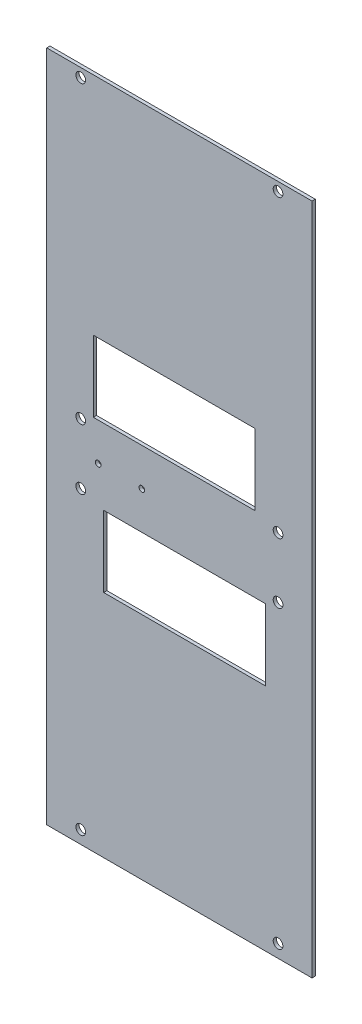
ISO-10303-21;
HEADER;
FILE_DESCRIPTION(('STEP AP214'),'2;1');
FILE_NAME('part.step','',(''),(''),'','','');
FILE_SCHEMA(('AUTOMOTIVE_DESIGN { 1 0 10303 214 1 1 1 1 }'));
ENDSEC;
DATA;
#1=APPLICATION_CONTEXT('core data for automotive mechanical design processes');
#2=APPLICATION_PROTOCOL_DEFINITION('international standard','automotive_design',2000,#1);
#3=PRODUCT_CONTEXT('',#1,'mechanical');
#4=PRODUCT('Part','Part','',(#3));
#5=PRODUCT_RELATED_PRODUCT_CATEGORY('part','',(#4));
#6=PRODUCT_DEFINITION_FORMATION('','',#4);
#7=PRODUCT_DEFINITION_CONTEXT('part definition',#1,'design');
#8=PRODUCT_DEFINITION('design','',#6,#7);
#9=PRODUCT_DEFINITION_SHAPE('','',#8);
#10=(LENGTH_UNIT() NAMED_UNIT(*) SI_UNIT(.MILLI.,.METRE.));
#11=(NAMED_UNIT(*) PLANE_ANGLE_UNIT() SI_UNIT($,.RADIAN.));
#12=(NAMED_UNIT(*) SI_UNIT($,.STERADIAN.) SOLID_ANGLE_UNIT());
#13=UNCERTAINTY_MEASURE_WITH_UNIT(LENGTH_MEASURE(1.E-05),#10,'distance_accuracy_value','');
#14=(GEOMETRIC_REPRESENTATION_CONTEXT(3) GLOBAL_UNCERTAINTY_ASSIGNED_CONTEXT((#13)) GLOBAL_UNIT_ASSIGNED_CONTEXT((#10,
#11,#12)) REPRESENTATION_CONTEXT('',''));
#15=CARTESIAN_POINT('',(0.,0.,0.));
#16=DIRECTION('',(0.,0.,1.));
#17=DIRECTION('',(1.,0.,0.));
#18=AXIS2_PLACEMENT_3D('',#15,#16,#17);
#19=CARTESIAN_POINT('',(41.6,-104.,1.));
#20=DIRECTION('',(0.,1.,0.));
#21=DIRECTION('',(-1.,0.,0.));
#22=AXIS2_PLACEMENT_3D('',#19,#20,#21);
#23=PLANE('',#22);
#24=DIRECTION('',(0.,0.,1.));
#25=VECTOR('',#24,1.);
#26=CARTESIAN_POINT('',(-41.,-104.,-9.));
#27=LINE('',#26,#25);
#28=CARTESIAN_POINT('',(-41.,-104.,0.));
#29=VERTEX_POINT('',#28);
#30=CARTESIAN_POINT('',(-41.,-104.,1.));
#31=VERTEX_POINT('',#30);
#32=EDGE_CURVE('E128',#29,#31,#27,.T.);
#33=ORIENTED_EDGE('',*,*,#32,.F.);
#34=DIRECTION('',(1.,0.,0.));
#35=VECTOR('',#34,1.);
#36=CARTESIAN_POINT('',(41.6,-104.,0.));
#37=LINE('',#36,#35);
#38=CARTESIAN_POINT('',(41.,-104.,0.));
#39=VERTEX_POINT('',#38);
#40=EDGE_CURVE('E137',#29,#39,#37,.T.);
#41=ORIENTED_EDGE('',*,*,#40,.T.);
#42=DIRECTION('',(0.,0.,1.));
#43=VECTOR('',#42,1.);
#44=CARTESIAN_POINT('',(41.,-104.,-9.));
#45=LINE('',#44,#43);
#46=CARTESIAN_POINT('',(41.,-104.,1.));
#47=VERTEX_POINT('',#46);
#48=EDGE_CURVE('E49',#39,#47,#45,.T.);
#49=ORIENTED_EDGE('',*,*,#48,.T.);
#50=DIRECTION('',(1.,0.,0.));
#51=VECTOR('',#50,1.);
#52=CARTESIAN_POINT('',(41.6,-104.,1.));
#53=LINE('',#52,#51);
#54=EDGE_CURVE('E135',#31,#47,#53,.T.);
#55=ORIENTED_EDGE('',*,*,#54,.F.);
#56=EDGE_LOOP('',(#33,#41,#49,#55));
#57=FACE_BOUND('',#56,.T.);
#58=ADVANCED_FACE('F35',(#57),#23,.F.);
#59=CARTESIAN_POINT('',(41.6,104.,1.));
#60=DIRECTION('',(0.,-1.,0.));
#61=DIRECTION('',(0.,0.,-1.));
#62=AXIS2_PLACEMENT_3D('',#59,#60,#61);
#63=PLANE('',#62);
#64=DIRECTION('',(0.,0.,1.));
#65=VECTOR('',#64,1.);
#66=CARTESIAN_POINT('',(-41.,104.,-9.));
#67=LINE('',#66,#65);
#68=CARTESIAN_POINT('',(-41.,104.,0.));
#69=VERTEX_POINT('',#68);
#70=CARTESIAN_POINT('',(-41.,104.,1.));
#71=VERTEX_POINT('',#70);
#72=EDGE_CURVE('E56',#69,#71,#67,.T.);
#73=ORIENTED_EDGE('',*,*,#72,.T.);
#74=DIRECTION('',(-1.,0.,0.));
#75=VECTOR('',#74,1.);
#76=CARTESIAN_POINT('',(41.6,104.,1.));
#77=LINE('',#76,#75);
#78=CARTESIAN_POINT('',(41.,104.,1.));
#79=VERTEX_POINT('',#78);
#80=EDGE_CURVE('E141',#79,#71,#77,.T.);
#81=ORIENTED_EDGE('',*,*,#80,.F.);
#82=DIRECTION('',(0.,0.,1.));
#83=VECTOR('',#82,1.);
#84=CARTESIAN_POINT('',(41.,104.,-9.));
#85=LINE('',#84,#83);
#86=CARTESIAN_POINT('',(41.,104.,0.));
#87=VERTEX_POINT('',#86);
#88=EDGE_CURVE('E123',#87,#79,#85,.T.);
#89=ORIENTED_EDGE('',*,*,#88,.F.);
#90=DIRECTION('',(-1.,0.,0.));
#91=VECTOR('',#90,1.);
#92=CARTESIAN_POINT('',(41.6,104.,0.));
#93=LINE('',#92,#91);
#94=EDGE_CURVE('E142',#87,#69,#93,.T.);
#95=ORIENTED_EDGE('',*,*,#94,.T.);
#96=EDGE_LOOP('',(#73,#81,#89,#95));
#97=FACE_BOUND('',#96,.T.);
#98=ADVANCED_FACE('F178',(#97),#63,.F.);
#99=CARTESIAN_POINT('',(0.,0.,1.));
#100=DIRECTION('',(0.,0.,1.));
#101=DIRECTION('',(1.,0.,0.));
#102=AXIS2_PLACEMENT_3D('',#99,#100,#101);
#103=PLANE('',#102);
#104=CARTESIAN_POINT('',(-25.0999759143177,0.649999999999928,1.));
#105=DIRECTION('',(0.,0.,1.));
#106=DIRECTION('',(1.,0.,0.));
#107=AXIS2_PLACEMENT_3D('',#104,#105,#106);
#108=CIRCLE('',#107,0.874999999999987);
#109=CARTESIAN_POINT('',(-24.2249759143177,0.649999999999928,1.));
#110=VERTEX_POINT('',#109);
#111=EDGE_CURVE('E184',#110,#110,#108,.T.);
#112=ORIENTED_EDGE('',*,*,#111,.F.);
#113=EDGE_LOOP('',(#112));
#114=FACE_BOUND('',#113,.T.);
#115=CARTESIAN_POINT('',(-11.5999759143177,0.649999999999929,1.));
#116=DIRECTION('',(0.,0.,1.));
#117=DIRECTION('',(1.,0.,0.));
#118=AXIS2_PLACEMENT_3D('',#115,#116,#117);
#119=CIRCLE('',#118,0.874999999999987);
#120=CARTESIAN_POINT('',(-10.7249759143177,0.649999999999929,1.));
#121=VERTEX_POINT('',#120);
#122=EDGE_CURVE('E190',#121,#121,#119,.T.);
#123=ORIENTED_EDGE('',*,*,#122,.F.);
#124=EDGE_LOOP('',(#123));
#125=FACE_BOUND('',#124,.T.);
#126=DIRECTION('',(0.,1.,0.));
#127=VECTOR('',#126,1.);
#128=CARTESIAN_POINT('',(23.4,34.3,1.));
#129=LINE('',#128,#127);
#130=CARTESIAN_POINT('',(23.4,12.3,1.));
#131=VERTEX_POINT('',#130);
#132=CARTESIAN_POINT('',(23.4,34.3,1.));
#133=VERTEX_POINT('',#132);
#134=EDGE_CURVE('E196',#131,#133,#129,.T.);
#135=ORIENTED_EDGE('',*,*,#134,.F.);
#136=DIRECTION('',(1.,0.,0.));
#137=VECTOR('',#136,1.);
#138=CARTESIAN_POINT('',(23.4,12.3,1.));
#139=LINE('',#138,#137);
#140=CARTESIAN_POINT('',(-26.6,12.3,1.));
#141=VERTEX_POINT('',#140);
#142=EDGE_CURVE('E204',#141,#131,#139,.T.);
#143=ORIENTED_EDGE('',*,*,#142,.F.);
#144=DIRECTION('',(0.,-1.,0.));
#145=VECTOR('',#144,1.);
#146=CARTESIAN_POINT('',(-26.6,34.3,1.));
#147=LINE('',#146,#145);
#148=CARTESIAN_POINT('',(-26.6,34.3,1.));
#149=VERTEX_POINT('',#148);
#150=EDGE_CURVE('E201',#149,#141,#147,.T.);
#151=ORIENTED_EDGE('',*,*,#150,.F.);
#152=DIRECTION('',(-1.,0.,0.));
#153=VECTOR('',#152,1.);
#154=CARTESIAN_POINT('',(23.4,34.3,1.));
#155=LINE('',#154,#153);
#156=EDGE_CURVE('E198',#133,#149,#155,.T.);
#157=ORIENTED_EDGE('',*,*,#156,.F.);
#158=EDGE_LOOP('',(#135,#143,#151,#157));
#159=FACE_BOUND('',#158,.T.);
#160=DIRECTION('',(0.,-1.,0.));
#161=VECTOR('',#160,1.);
#162=CARTESIAN_POINT('',(-23.4,-33.,1.));
#163=LINE('',#162,#161);
#164=CARTESIAN_POINT('',(-23.4,-11.,1.));
#165=VERTEX_POINT('',#164);
#166=CARTESIAN_POINT('',(-23.4,-33.,1.));
#167=VERTEX_POINT('',#166);
#168=EDGE_CURVE('E210',#165,#167,#163,.T.);
#169=ORIENTED_EDGE('',*,*,#168,.F.);
#170=DIRECTION('',(-1.,0.,0.));
#171=VECTOR('',#170,1.);
#172=CARTESIAN_POINT('',(-23.4,-11.,1.));
#173=LINE('',#172,#171);
#174=CARTESIAN_POINT('',(26.6,-11.,1.));
#175=VERTEX_POINT('',#174);
#176=EDGE_CURVE('E224',#175,#165,#173,.T.);
#177=ORIENTED_EDGE('',*,*,#176,.F.);
#178=DIRECTION('',(0.,1.,0.));
#179=VECTOR('',#178,1.);
#180=CARTESIAN_POINT('',(26.6,-33.,1.));
#181=LINE('',#180,#179);
#182=CARTESIAN_POINT('',(26.6,-33.,1.));
#183=VERTEX_POINT('',#182);
#184=EDGE_CURVE('E221',#183,#175,#181,.T.);
#185=ORIENTED_EDGE('',*,*,#184,.F.);
#186=DIRECTION('',(1.,0.,0.));
#187=VECTOR('',#186,1.);
#188=CARTESIAN_POINT('',(-23.4,-33.,1.));
#189=LINE('',#188,#187);
#190=EDGE_CURVE('E218',#167,#183,#189,.T.);
#191=ORIENTED_EDGE('',*,*,#190,.F.);
#192=EDGE_LOOP('',(#169,#177,#185,#191));
#193=FACE_BOUND('',#192,.T.);
#194=CARTESIAN_POINT('',(-30.5,9.99999999999963,1.));
#195=DIRECTION('',(0.,0.,1.));
#196=DIRECTION('',(1.,0.,0.));
#197=AXIS2_PLACEMENT_3D('',#194,#195,#196);
#198=CIRCLE('',#197,1.5);
#199=CARTESIAN_POINT('',(-29.,9.99999999999963,1.));
#200=VERTEX_POINT('',#199);
#201=EDGE_CURVE('E230',#200,#200,#198,.T.);
#202=ORIENTED_EDGE('',*,*,#201,.F.);
#203=EDGE_LOOP('',(#202));
#204=FACE_BOUND('',#203,.T.);
#205=CARTESIAN_POINT('',(30.5,9.9999999999994,1.));
#206=DIRECTION('',(0.,0.,1.));
#207=DIRECTION('',(1.,0.,0.));
#208=AXIS2_PLACEMENT_3D('',#205,#206,#207);
#209=CIRCLE('',#208,1.5);
#210=CARTESIAN_POINT('',(32.,9.9999999999994,1.));
#211=VERTEX_POINT('',#210);
#212=EDGE_CURVE('E242',#211,#211,#209,.T.);
#213=ORIENTED_EDGE('',*,*,#212,.F.);
#214=EDGE_LOOP('',(#213));
#215=FACE_BOUND('',#214,.T.);
#216=CARTESIAN_POINT('',(30.5,-100.,1.));
#217=DIRECTION('',(0.,0.,1.));
#218=DIRECTION('',(1.,0.,0.));
#219=AXIS2_PLACEMENT_3D('',#216,#217,#218);
#220=CIRCLE('',#219,1.5);
#221=CARTESIAN_POINT('',(32.,-100.,1.));
#222=VERTEX_POINT('',#221);
#223=EDGE_CURVE('E248',#222,#222,#220,.T.);
#224=ORIENTED_EDGE('',*,*,#223,.F.);
#225=EDGE_LOOP('',(#224));
#226=FACE_BOUND('',#225,.T.);
#227=CARTESIAN_POINT('',(-30.5,-100.,1.));
#228=DIRECTION('',(0.,0.,1.));
#229=DIRECTION('',(1.,0.,0.));
#230=AXIS2_PLACEMENT_3D('',#227,#228,#229);
#231=CIRCLE('',#230,1.5);
#232=CARTESIAN_POINT('',(-29.,-100.,1.));
#233=VERTEX_POINT('',#232);
#234=EDGE_CURVE('E254',#233,#233,#231,.T.);
#235=ORIENTED_EDGE('',*,*,#234,.F.);
#236=EDGE_LOOP('',(#235));
#237=FACE_BOUND('',#236,.T.);
#238=CARTESIAN_POINT('',(-30.5,101.3,1.));
#239=DIRECTION('',(0.,0.,1.));
#240=DIRECTION('',(1.,0.,0.));
#241=AXIS2_PLACEMENT_3D('',#238,#239,#240);
#242=CIRCLE('',#241,1.5);
#243=CARTESIAN_POINT('',(-29.,101.3,1.));
#244=VERTEX_POINT('',#243);
#245=EDGE_CURVE('E260',#244,#244,#242,.T.);
#246=ORIENTED_EDGE('',*,*,#245,.F.);
#247=EDGE_LOOP('',(#246));
#248=FACE_BOUND('',#247,.T.);
#249=CARTESIAN_POINT('',(30.5,101.3,1.));
#250=DIRECTION('',(0.,0.,1.));
#251=DIRECTION('',(1.,0.,0.));
#252=AXIS2_PLACEMENT_3D('',#249,#250,#251);
#253=CIRCLE('',#252,1.5);
#254=CARTESIAN_POINT('',(32.,101.3,1.));
#255=VERTEX_POINT('',#254);
#256=EDGE_CURVE('E266',#255,#255,#253,.T.);
#257=ORIENTED_EDGE('',*,*,#256,.F.);
#258=EDGE_LOOP('',(#257));
#259=FACE_BOUND('',#258,.T.);
#260=CARTESIAN_POINT('',(-30.5000000000001,-8.70000000000008,1.));
#261=DIRECTION('',(0.,0.,1.));
#262=DIRECTION('',(1.,0.,0.));
#263=AXIS2_PLACEMENT_3D('',#260,#261,#262);
#264=CIRCLE('',#263,1.5);
#265=CARTESIAN_POINT('',(-29.0000000000001,-8.70000000000008,1.));
#266=VERTEX_POINT('',#265);
#267=EDGE_CURVE('E272',#266,#266,#264,.T.);
#268=ORIENTED_EDGE('',*,*,#267,.F.);
#269=EDGE_LOOP('',(#268));
#270=FACE_BOUND('',#269,.T.);
#271=CARTESIAN_POINT('',(30.4999999999999,-8.70000000000004,1.));
#272=DIRECTION('',(0.,0.,1.));
#273=DIRECTION('',(1.,0.,0.));
#274=AXIS2_PLACEMENT_3D('',#271,#272,#273);
#275=CIRCLE('',#274,1.5);
#276=CARTESIAN_POINT('',(31.9999999999999,-8.70000000000004,1.));
#277=VERTEX_POINT('',#276);
#278=EDGE_CURVE('E277',#277,#277,#275,.T.);
#279=ORIENTED_EDGE('',*,*,#278,.F.);
#280=EDGE_LOOP('',(#279));
#281=FACE_BOUND('',#280,.T.);
#282=ORIENTED_EDGE('',*,*,#80,.T.);
#283=DIRECTION('',(0.,-1.,0.));
#284=VECTOR('',#283,1.);
#285=CARTESIAN_POINT('',(-41.,-104.,1.));
#286=LINE('',#285,#284);
#287=EDGE_CURVE('E129',#71,#31,#286,.T.);
#288=ORIENTED_EDGE('',*,*,#287,.T.);
#289=ORIENTED_EDGE('',*,*,#54,.T.);
#290=DIRECTION('',(0.,1.,0.));
#291=VECTOR('',#290,1.);
#292=CARTESIAN_POINT('',(41.,-104.,1.));
#293=LINE('',#292,#291);
#294=EDGE_CURVE('E120',#47,#79,#293,.T.);
#295=ORIENTED_EDGE('',*,*,#294,.T.);
#296=EDGE_LOOP('',(#282,#288,#289,#295));
#297=FACE_BOUND('',#296,.T.);
#298=ADVANCED_FACE('F140',(#114,#125,#159,#193,#204,#215,#226,#237,#248,#259,#270,#281,#297),
#103,.T.);
#299=CARTESIAN_POINT('',(0.,0.,0.));
#300=DIRECTION('',(0.,0.,1.));
#301=DIRECTION('',(1.,0.,0.));
#302=AXIS2_PLACEMENT_3D('',#299,#300,#301);
#303=PLANE('',#302);
#304=CARTESIAN_POINT('',(-25.0999759143177,0.649999999999928,0.));
#305=DIRECTION('',(0.,0.,1.));
#306=DIRECTION('',(1.,0.,0.));
#307=AXIS2_PLACEMENT_3D('',#304,#305,#306);
#308=CIRCLE('',#307,0.874999999999997);
#309=CARTESIAN_POINT('',(-24.2249759143177,0.649999999999928,0.));
#310=VERTEX_POINT('',#309);
#311=EDGE_CURVE('E187',#310,#310,#308,.T.);
#312=ORIENTED_EDGE('',*,*,#311,.T.);
#313=EDGE_LOOP('',(#312));
#314=FACE_BOUND('',#313,.T.);
#315=CARTESIAN_POINT('',(-11.5999759143177,0.649999999999929,0.));
#316=DIRECTION('',(0.,0.,1.));
#317=DIRECTION('',(1.,0.,0.));
#318=AXIS2_PLACEMENT_3D('',#315,#316,#317);
#319=CIRCLE('',#318,0.874999999999999);
#320=CARTESIAN_POINT('',(-10.7249759143177,0.649999999999929,0.));
#321=VERTEX_POINT('',#320);
#322=EDGE_CURVE('E193',#321,#321,#319,.T.);
#323=ORIENTED_EDGE('',*,*,#322,.T.);
#324=EDGE_LOOP('',(#323));
#325=FACE_BOUND('',#324,.T.);
#326=DIRECTION('',(1.,0.,0.));
#327=VECTOR('',#326,1.);
#328=CARTESIAN_POINT('',(0.,12.3,0.));
#329=LINE('',#328,#327);
#330=CARTESIAN_POINT('',(-26.6,12.3,0.));
#331=VERTEX_POINT('',#330);
#332=CARTESIAN_POINT('',(23.4,12.3,0.));
#333=VERTEX_POINT('',#332);
#334=EDGE_CURVE('E170',#331,#333,#329,.T.);
#335=ORIENTED_EDGE('',*,*,#334,.T.);
#336=DIRECTION('',(0.,1.,0.));
#337=VECTOR('',#336,1.);
#338=CARTESIAN_POINT('',(23.4,0.,0.));
#339=LINE('',#338,#337);
#340=CARTESIAN_POINT('',(23.4,34.3,0.));
#341=VERTEX_POINT('',#340);
#342=EDGE_CURVE('E173',#333,#341,#339,.T.);
#343=ORIENTED_EDGE('',*,*,#342,.T.);
#344=DIRECTION('',(-1.,0.,0.));
#345=VECTOR('',#344,1.);
#346=CARTESIAN_POINT('',(0.,34.3,0.));
#347=LINE('',#346,#345);
#348=CARTESIAN_POINT('',(-26.6,34.3,0.));
#349=VERTEX_POINT('',#348);
#350=EDGE_CURVE('E164',#341,#349,#347,.T.);
#351=ORIENTED_EDGE('',*,*,#350,.T.);
#352=DIRECTION('',(0.,-1.,0.));
#353=VECTOR('',#352,1.);
#354=CARTESIAN_POINT('',(-26.6,0.,0.));
#355=LINE('',#354,#353);
#356=EDGE_CURVE('E167',#349,#331,#355,.T.);
#357=ORIENTED_EDGE('',*,*,#356,.T.);
#358=EDGE_LOOP('',(#335,#343,#351,#357));
#359=FACE_BOUND('',#358,.T.);
#360=DIRECTION('',(-1.,0.,0.));
#361=VECTOR('',#360,1.);
#362=CARTESIAN_POINT('',(0.,-11.,0.));
#363=LINE('',#362,#361);
#364=CARTESIAN_POINT('',(26.6,-11.,0.));
#365=VERTEX_POINT('',#364);
#366=CARTESIAN_POINT('',(-23.4,-11.,0.));
#367=VERTEX_POINT('',#366);
#368=EDGE_CURVE('E158',#365,#367,#363,.T.);
#369=ORIENTED_EDGE('',*,*,#368,.T.);
#370=DIRECTION('',(0.,-1.,0.));
#371=VECTOR('',#370,1.);
#372=CARTESIAN_POINT('',(-23.4,0.,0.));
#373=LINE('',#372,#371);
#374=CARTESIAN_POINT('',(-23.4,-33.,0.));
#375=VERTEX_POINT('',#374);
#376=EDGE_CURVE('E161',#367,#375,#373,.T.);
#377=ORIENTED_EDGE('',*,*,#376,.T.);
#378=DIRECTION('',(1.,0.,0.));
#379=VECTOR('',#378,1.);
#380=CARTESIAN_POINT('',(0.,-33.,0.));
#381=LINE('',#380,#379);
#382=CARTESIAN_POINT('',(26.6,-33.,0.));
#383=VERTEX_POINT('',#382);
#384=EDGE_CURVE('E144',#375,#383,#381,.T.);
#385=ORIENTED_EDGE('',*,*,#384,.T.);
#386=DIRECTION('',(0.,1.,0.));
#387=VECTOR('',#386,1.);
#388=CARTESIAN_POINT('',(26.6,0.,0.));
#389=LINE('',#388,#387);
#390=EDGE_CURVE('E155',#383,#365,#389,.T.);
#391=ORIENTED_EDGE('',*,*,#390,.T.);
#392=EDGE_LOOP('',(#369,#377,#385,#391));
#393=FACE_BOUND('',#392,.T.);
#394=CARTESIAN_POINT('',(-30.5,9.99999999999963,0.));
#395=DIRECTION('',(0.,0.,1.));
#396=DIRECTION('',(1.,0.,0.));
#397=AXIS2_PLACEMENT_3D('',#394,#395,#396);
#398=CIRCLE('',#397,1.5);
#399=CARTESIAN_POINT('',(-29.,9.99999999999963,0.));
#400=VERTEX_POINT('',#399);
#401=EDGE_CURVE('E239',#400,#400,#398,.T.);
#402=ORIENTED_EDGE('',*,*,#401,.T.);
#403=EDGE_LOOP('',(#402));
#404=FACE_BOUND('',#403,.T.);
#405=CARTESIAN_POINT('',(30.5,9.9999999999994,0.));
#406=DIRECTION('',(0.,0.,1.));
#407=DIRECTION('',(1.,0.,0.));
#408=AXIS2_PLACEMENT_3D('',#405,#406,#407);
#409=CIRCLE('',#408,1.5);
#410=CARTESIAN_POINT('',(32.,9.9999999999994,0.));
#411=VERTEX_POINT('',#410);
#412=EDGE_CURVE('E245',#411,#411,#409,.T.);
#413=ORIENTED_EDGE('',*,*,#412,.T.);
#414=EDGE_LOOP('',(#413));
#415=FACE_BOUND('',#414,.T.);
#416=CARTESIAN_POINT('',(30.5,-100.,0.));
#417=DIRECTION('',(0.,0.,1.));
#418=DIRECTION('',(1.,0.,0.));
#419=AXIS2_PLACEMENT_3D('',#416,#417,#418);
#420=CIRCLE('',#419,1.5);
#421=CARTESIAN_POINT('',(32.,-100.,0.));
#422=VERTEX_POINT('',#421);
#423=EDGE_CURVE('E251',#422,#422,#420,.T.);
#424=ORIENTED_EDGE('',*,*,#423,.T.);
#425=EDGE_LOOP('',(#424));
#426=FACE_BOUND('',#425,.T.);
#427=CARTESIAN_POINT('',(-30.5,-100.,0.));
#428=DIRECTION('',(0.,0.,1.));
#429=DIRECTION('',(1.,0.,0.));
#430=AXIS2_PLACEMENT_3D('',#427,#428,#429);
#431=CIRCLE('',#430,1.5);
#432=CARTESIAN_POINT('',(-29.,-100.,0.));
#433=VERTEX_POINT('',#432);
#434=EDGE_CURVE('E257',#433,#433,#431,.T.);
#435=ORIENTED_EDGE('',*,*,#434,.T.);
#436=EDGE_LOOP('',(#435));
#437=FACE_BOUND('',#436,.T.);
#438=CARTESIAN_POINT('',(-30.5,101.3,0.));
#439=DIRECTION('',(0.,0.,1.));
#440=DIRECTION('',(1.,0.,0.));
#441=AXIS2_PLACEMENT_3D('',#438,#439,#440);
#442=CIRCLE('',#441,1.5);
#443=CARTESIAN_POINT('',(-29.,101.3,0.));
#444=VERTEX_POINT('',#443);
#445=EDGE_CURVE('E263',#444,#444,#442,.T.);
#446=ORIENTED_EDGE('',*,*,#445,.T.);
#447=EDGE_LOOP('',(#446));
#448=FACE_BOUND('',#447,.T.);
#449=CARTESIAN_POINT('',(30.5,101.3,0.));
#450=DIRECTION('',(0.,0.,1.));
#451=DIRECTION('',(1.,0.,0.));
#452=AXIS2_PLACEMENT_3D('',#449,#450,#451);
#453=CIRCLE('',#452,1.5);
#454=CARTESIAN_POINT('',(32.,101.3,0.));
#455=VERTEX_POINT('',#454);
#456=EDGE_CURVE('E269',#455,#455,#453,.T.);
#457=ORIENTED_EDGE('',*,*,#456,.T.);
#458=EDGE_LOOP('',(#457));
#459=FACE_BOUND('',#458,.T.);
#460=CARTESIAN_POINT('',(-30.5000000000001,-8.70000000000008,0.));
#461=DIRECTION('',(0.,0.,1.));
#462=DIRECTION('',(1.,0.,0.));
#463=AXIS2_PLACEMENT_3D('',#460,#461,#462);
#464=CIRCLE('',#463,1.5);
#465=CARTESIAN_POINT('',(-29.0000000000001,-8.70000000000008,0.));
#466=VERTEX_POINT('',#465);
#467=EDGE_CURVE('E275',#466,#466,#464,.T.);
#468=ORIENTED_EDGE('',*,*,#467,.T.);
#469=EDGE_LOOP('',(#468));
#470=FACE_BOUND('',#469,.T.);
#471=CARTESIAN_POINT('',(30.4999999999999,-8.70000000000004,0.));
#472=DIRECTION('',(0.,0.,1.));
#473=DIRECTION('',(1.,0.,0.));
#474=AXIS2_PLACEMENT_3D('',#471,#472,#473);
#475=CIRCLE('',#474,1.5);
#476=CARTESIAN_POINT('',(31.9999999999999,-8.70000000000004,0.));
#477=VERTEX_POINT('',#476);
#478=EDGE_CURVE('E149',#477,#477,#475,.T.);
#479=ORIENTED_EDGE('',*,*,#478,.T.);
#480=EDGE_LOOP('',(#479));
#481=FACE_BOUND('',#480,.T.);
#482=DIRECTION('',(0.,-1.,0.));
#483=VECTOR('',#482,1.);
#484=CARTESIAN_POINT('',(-41.,0.,0.));
#485=LINE('',#484,#483);
#486=EDGE_CURVE('E11',#69,#29,#485,.T.);
#487=ORIENTED_EDGE('',*,*,#486,.F.);
#488=ORIENTED_EDGE('',*,*,#94,.F.);
#489=DIRECTION('',(0.,1.,0.));
#490=VECTOR('',#489,1.);
#491=CARTESIAN_POINT('',(41.,0.,0.));
#492=LINE('',#491,#490);
#493=EDGE_CURVE('E42',#39,#87,#492,.T.);
#494=ORIENTED_EDGE('',*,*,#493,.F.);
#495=ORIENTED_EDGE('',*,*,#40,.F.);
#496=EDGE_LOOP('',(#487,#488,#494,#495));
#497=FACE_BOUND('',#496,.T.);
#498=ADVANCED_FACE('F180',(#314,#325,#359,#393,#404,#415,#426,#437,#448,#459,#470,#481,#497),
#303,.F.);
#499=CARTESIAN_POINT('',(30.4999999999999,-8.70000000000004,1.));
#500=DIRECTION('',(0.,0.,1.));
#501=DIRECTION('',(1.,0.,0.));
#502=AXIS2_PLACEMENT_3D('',#499,#500,#501);
#503=CYLINDRICAL_SURFACE('',#502,1.5);
#504=ORIENTED_EDGE('',*,*,#478,.F.);
#505=EDGE_LOOP('',(#504));
#506=FACE_BOUND('',#505,.T.);
#507=ORIENTED_EDGE('',*,*,#278,.T.);
#508=EDGE_LOOP('',(#507));
#509=FACE_BOUND('',#508,.T.);
#510=ADVANCED_FACE('F285',(#506,#509),#503,.F.);
#511=CARTESIAN_POINT('',(-30.5000000000001,-8.70000000000008,1.));
#512=DIRECTION('',(0.,0.,1.));
#513=DIRECTION('',(1.,0.,0.));
#514=AXIS2_PLACEMENT_3D('',#511,#512,#513);
#515=CYLINDRICAL_SURFACE('',#514,1.5);
#516=ORIENTED_EDGE('',*,*,#467,.F.);
#517=EDGE_LOOP('',(#516));
#518=FACE_BOUND('',#517,.T.);
#519=ORIENTED_EDGE('',*,*,#267,.T.);
#520=EDGE_LOOP('',(#519));
#521=FACE_BOUND('',#520,.T.);
#522=ADVANCED_FACE('F287',(#518,#521),#515,.F.);
#523=CARTESIAN_POINT('',(30.5,101.3,1.));
#524=DIRECTION('',(0.,0.,1.));
#525=DIRECTION('',(1.,0.,0.));
#526=AXIS2_PLACEMENT_3D('',#523,#524,#525);
#527=CYLINDRICAL_SURFACE('',#526,1.5);
#528=ORIENTED_EDGE('',*,*,#456,.F.);
#529=EDGE_LOOP('',(#528));
#530=FACE_BOUND('',#529,.T.);
#531=ORIENTED_EDGE('',*,*,#256,.T.);
#532=EDGE_LOOP('',(#531));
#533=FACE_BOUND('',#532,.T.);
#534=ADVANCED_FACE('F293',(#530,#533),#527,.F.);
#535=CARTESIAN_POINT('',(-30.5,101.3,1.));
#536=DIRECTION('',(0.,0.,1.));
#537=DIRECTION('',(1.,0.,0.));
#538=AXIS2_PLACEMENT_3D('',#535,#536,#537);
#539=CYLINDRICAL_SURFACE('',#538,1.5);
#540=ORIENTED_EDGE('',*,*,#445,.F.);
#541=EDGE_LOOP('',(#540));
#542=FACE_BOUND('',#541,.T.);
#543=ORIENTED_EDGE('',*,*,#245,.T.);
#544=EDGE_LOOP('',(#543));
#545=FACE_BOUND('',#544,.T.);
#546=ADVANCED_FACE('F338',(#542,#545),#539,.F.);
#547=CARTESIAN_POINT('',(-30.5,-100.,1.));
#548=DIRECTION('',(0.,0.,1.));
#549=DIRECTION('',(1.,0.,0.));
#550=AXIS2_PLACEMENT_3D('',#547,#548,#549);
#551=CYLINDRICAL_SURFACE('',#550,1.5);
#552=ORIENTED_EDGE('',*,*,#434,.F.);
#553=EDGE_LOOP('',(#552));
#554=FACE_BOUND('',#553,.T.);
#555=ORIENTED_EDGE('',*,*,#234,.T.);
#556=EDGE_LOOP('',(#555));
#557=FACE_BOUND('',#556,.T.);
#558=ADVANCED_FACE('F344',(#554,#557),#551,.F.);
#559=CARTESIAN_POINT('',(30.5,-100.,1.));
#560=DIRECTION('',(0.,0.,1.));
#561=DIRECTION('',(1.,0.,0.));
#562=AXIS2_PLACEMENT_3D('',#559,#560,#561);
#563=CYLINDRICAL_SURFACE('',#562,1.5);
#564=ORIENTED_EDGE('',*,*,#423,.F.);
#565=EDGE_LOOP('',(#564));
#566=FACE_BOUND('',#565,.T.);
#567=ORIENTED_EDGE('',*,*,#223,.T.);
#568=EDGE_LOOP('',(#567));
#569=FACE_BOUND('',#568,.T.);
#570=ADVANCED_FACE('F351',(#566,#569),#563,.F.);
#571=CARTESIAN_POINT('',(30.5,9.9999999999994,1.));
#572=DIRECTION('',(0.,0.,1.));
#573=DIRECTION('',(1.,0.,0.));
#574=AXIS2_PLACEMENT_3D('',#571,#572,#573);
#575=CYLINDRICAL_SURFACE('',#574,1.5);
#576=ORIENTED_EDGE('',*,*,#412,.F.);
#577=EDGE_LOOP('',(#576));
#578=FACE_BOUND('',#577,.T.);
#579=ORIENTED_EDGE('',*,*,#212,.T.);
#580=EDGE_LOOP('',(#579));
#581=FACE_BOUND('',#580,.T.);
#582=ADVANCED_FACE('F355',(#578,#581),#575,.F.);
#583=CARTESIAN_POINT('',(-30.5,9.99999999999963,1.));
#584=DIRECTION('',(0.,0.,1.));
#585=DIRECTION('',(1.,0.,0.));
#586=AXIS2_PLACEMENT_3D('',#583,#584,#585);
#587=CYLINDRICAL_SURFACE('',#586,1.5);
#588=ORIENTED_EDGE('',*,*,#401,.F.);
#589=EDGE_LOOP('',(#588));
#590=FACE_BOUND('',#589,.T.);
#591=ORIENTED_EDGE('',*,*,#201,.T.);
#592=EDGE_LOOP('',(#591));
#593=FACE_BOUND('',#592,.T.);
#594=ADVANCED_FACE('F359',(#590,#593),#587,.F.);
#595=CARTESIAN_POINT('',(-23.4,-33.,-9.));
#596=DIRECTION('',(-1.,0.,0.));
#597=DIRECTION('',(0.,0.,1.));
#598=AXIS2_PLACEMENT_3D('',#595,#596,#597);
#599=PLANE('',#598);
#600=DIRECTION('',(0.,0.,1.));
#601=VECTOR('',#600,1.);
#602=CARTESIAN_POINT('',(-23.4,-11.,-9.));
#603=LINE('',#602,#601);
#604=EDGE_CURVE('E228',#367,#165,#603,.T.);
#605=ORIENTED_EDGE('',*,*,#604,.T.);
#606=ORIENTED_EDGE('',*,*,#168,.T.);
#607=DIRECTION('',(0.,0.,1.));
#608=VECTOR('',#607,1.);
#609=CARTESIAN_POINT('',(-23.4,-33.,-9.));
#610=LINE('',#609,#608);
#611=EDGE_CURVE('E227',#375,#167,#610,.T.);
#612=ORIENTED_EDGE('',*,*,#611,.F.);
#613=ORIENTED_EDGE('',*,*,#376,.F.);
#614=EDGE_LOOP('',(#605,#606,#612,#613));
#615=FACE_BOUND('',#614,.T.);
#616=ADVANCED_FACE('F363',(#615),#599,.F.);
#617=CARTESIAN_POINT('',(-23.4,-11.,-9.));
#618=DIRECTION('',(0.,1.,0.));
#619=DIRECTION('',(0.,0.,1.));
#620=AXIS2_PLACEMENT_3D('',#617,#618,#619);
#621=PLANE('',#620);
#622=DIRECTION('',(0.,0.,1.));
#623=VECTOR('',#622,1.);
#624=CARTESIAN_POINT('',(26.6,-11.,-9.));
#625=LINE('',#624,#623);
#626=EDGE_CURVE('E231',#365,#175,#625,.T.);
#627=ORIENTED_EDGE('',*,*,#626,.T.);
#628=ORIENTED_EDGE('',*,*,#176,.T.);
#629=ORIENTED_EDGE('',*,*,#604,.F.);
#630=ORIENTED_EDGE('',*,*,#368,.F.);
#631=EDGE_LOOP('',(#627,#628,#629,#630));
#632=FACE_BOUND('',#631,.T.);
#633=ADVANCED_FACE('F367',(#632),#621,.F.);
#634=CARTESIAN_POINT('',(26.6,-33.,-9.));
#635=DIRECTION('',(1.,0.,0.));
#636=DIRECTION('',(0.,0.,-1.));
#637=AXIS2_PLACEMENT_3D('',#634,#635,#636);
#638=PLANE('',#637);
#639=DIRECTION('',(0.,0.,1.));
#640=VECTOR('',#639,1.);
#641=CARTESIAN_POINT('',(26.6,-33.,-9.));
#642=LINE('',#641,#640);
#643=EDGE_CURVE('E233',#383,#183,#642,.T.);
#644=ORIENTED_EDGE('',*,*,#643,.T.);
#645=ORIENTED_EDGE('',*,*,#184,.T.);
#646=ORIENTED_EDGE('',*,*,#626,.F.);
#647=ORIENTED_EDGE('',*,*,#390,.F.);
#648=EDGE_LOOP('',(#644,#645,#646,#647));
#649=FACE_BOUND('',#648,.T.);
#650=ADVANCED_FACE('F373',(#649),#638,.F.);
#651=CARTESIAN_POINT('',(-23.4,-33.,-9.));
#652=DIRECTION('',(0.,-1.,0.));
#653=DIRECTION('',(0.,0.,-1.));
#654=AXIS2_PLACEMENT_3D('',#651,#652,#653);
#655=PLANE('',#654);
#656=ORIENTED_EDGE('',*,*,#611,.T.);
#657=ORIENTED_EDGE('',*,*,#190,.T.);
#658=ORIENTED_EDGE('',*,*,#643,.F.);
#659=ORIENTED_EDGE('',*,*,#384,.F.);
#660=EDGE_LOOP('',(#656,#657,#658,#659));
#661=FACE_BOUND('',#660,.T.);
#662=ADVANCED_FACE('F369',(#661),#655,.F.);
#663=CARTESIAN_POINT('',(23.4,34.3,-9.));
#664=DIRECTION('',(1.,0.,0.));
#665=DIRECTION('',(0.,1.,0.));
#666=AXIS2_PLACEMENT_3D('',#663,#664,#665);
#667=PLANE('',#666);
#668=DIRECTION('',(0.,0.,1.));
#669=VECTOR('',#668,1.);
#670=CARTESIAN_POINT('',(23.4,12.3,-9.));
#671=LINE('',#670,#669);
#672=EDGE_CURVE('E208',#333,#131,#671,.T.);
#673=ORIENTED_EDGE('',*,*,#672,.T.);
#674=ORIENTED_EDGE('',*,*,#134,.T.);
#675=DIRECTION('',(0.,0.,1.));
#676=VECTOR('',#675,1.);
#677=CARTESIAN_POINT('',(23.4,34.3,-9.));
#678=LINE('',#677,#676);
#679=EDGE_CURVE('E207',#341,#133,#678,.T.);
#680=ORIENTED_EDGE('',*,*,#679,.F.);
#681=ORIENTED_EDGE('',*,*,#342,.F.);
#682=EDGE_LOOP('',(#673,#674,#680,#681));
#683=FACE_BOUND('',#682,.T.);
#684=ADVANCED_FACE('F372',(#683),#667,.F.);
#685=CARTESIAN_POINT('',(23.4,12.3,-9.));
#686=DIRECTION('',(0.,-1.,0.));
#687=DIRECTION('',(1.,0.,0.));
#688=AXIS2_PLACEMENT_3D('',#685,#686,#687);
#689=PLANE('',#688);
#690=DIRECTION('',(0.,0.,1.));
#691=VECTOR('',#690,1.);
#692=CARTESIAN_POINT('',(-26.6,12.3,-9.));
#693=LINE('',#692,#691);
#694=EDGE_CURVE('E211',#331,#141,#693,.T.);
#695=ORIENTED_EDGE('',*,*,#694,.T.);
#696=ORIENTED_EDGE('',*,*,#142,.T.);
#697=ORIENTED_EDGE('',*,*,#672,.F.);
#698=ORIENTED_EDGE('',*,*,#334,.F.);
#699=EDGE_LOOP('',(#695,#696,#697,#698));
#700=FACE_BOUND('',#699,.T.);
#701=ADVANCED_FACE('F383',(#700),#689,.F.);
#702=CARTESIAN_POINT('',(-26.6,34.3,-9.));
#703=DIRECTION('',(-1.,0.,0.));
#704=DIRECTION('',(0.,-1.,0.));
#705=AXIS2_PLACEMENT_3D('',#702,#703,#704);
#706=PLANE('',#705);
#707=DIRECTION('',(0.,0.,1.));
#708=VECTOR('',#707,1.);
#709=CARTESIAN_POINT('',(-26.6,34.3,-9.));
#710=LINE('',#709,#708);
#711=EDGE_CURVE('E213',#349,#149,#710,.T.);
#712=ORIENTED_EDGE('',*,*,#711,.T.);
#713=ORIENTED_EDGE('',*,*,#150,.T.);
#714=ORIENTED_EDGE('',*,*,#694,.F.);
#715=ORIENTED_EDGE('',*,*,#356,.F.);
#716=EDGE_LOOP('',(#712,#713,#714,#715));
#717=FACE_BOUND('',#716,.T.);
#718=ADVANCED_FACE('F389',(#717),#706,.F.);
#719=CARTESIAN_POINT('',(23.4,34.3,-9.));
#720=DIRECTION('',(0.,1.,0.));
#721=DIRECTION('',(0.,0.,1.));
#722=AXIS2_PLACEMENT_3D('',#719,#720,#721);
#723=PLANE('',#722);
#724=ORIENTED_EDGE('',*,*,#679,.T.);
#725=ORIENTED_EDGE('',*,*,#156,.T.);
#726=ORIENTED_EDGE('',*,*,#711,.F.);
#727=ORIENTED_EDGE('',*,*,#350,.F.);
#728=EDGE_LOOP('',(#724,#725,#726,#727));
#729=FACE_BOUND('',#728,.T.);
#730=ADVANCED_FACE('F385',(#729),#723,.F.);
#731=CARTESIAN_POINT('',(-11.5999759143177,0.649999999999929,1.));
#732=DIRECTION('',(0.,0.,1.));
#733=DIRECTION('',(1.,0.,0.));
#734=AXIS2_PLACEMENT_3D('',#731,#732,#733);
#735=CYLINDRICAL_SURFACE('',#734,0.874999999999993);
#736=ORIENTED_EDGE('',*,*,#322,.F.);
#737=EDGE_LOOP('',(#736));
#738=FACE_BOUND('',#737,.T.);
#739=ORIENTED_EDGE('',*,*,#122,.T.);
#740=EDGE_LOOP('',(#739));
#741=FACE_BOUND('',#740,.T.);
#742=ADVANCED_FACE('F388',(#738,#741),#735,.F.);
#743=CARTESIAN_POINT('',(-25.0999759143177,0.649999999999928,1.));
#744=DIRECTION('',(0.,0.,1.));
#745=DIRECTION('',(1.,0.,0.));
#746=AXIS2_PLACEMENT_3D('',#743,#744,#745);
#747=CYLINDRICAL_SURFACE('',#746,0.874999999999992);
#748=ORIENTED_EDGE('',*,*,#311,.F.);
#749=EDGE_LOOP('',(#748));
#750=FACE_BOUND('',#749,.T.);
#751=ORIENTED_EDGE('',*,*,#111,.T.);
#752=EDGE_LOOP('',(#751));
#753=FACE_BOUND('',#752,.T.);
#754=ADVANCED_FACE('F399',(#750,#753),#747,.F.);
#755=CARTESIAN_POINT('',(41.,-104.,-9.));
#756=DIRECTION('',(1.,0.,0.));
#757=DIRECTION('',(0.,0.,-1.));
#758=AXIS2_PLACEMENT_3D('',#755,#756,#757);
#759=PLANE('',#758);
#760=ORIENTED_EDGE('',*,*,#493,.T.);
#761=ORIENTED_EDGE('',*,*,#88,.T.);
#762=ORIENTED_EDGE('',*,*,#294,.F.);
#763=ORIENTED_EDGE('',*,*,#48,.F.);
#764=EDGE_LOOP('',(#760,#761,#762,#763));
#765=FACE_BOUND('',#764,.T.);
#766=ADVANCED_FACE('F121',(#765),#759,.T.);
#767=CARTESIAN_POINT('',(-41.,-104.,-9.));
#768=DIRECTION('',(-1.,0.,0.));
#769=DIRECTION('',(0.,0.,1.));
#770=AXIS2_PLACEMENT_3D('',#767,#768,#769);
#771=PLANE('',#770);
#772=ORIENTED_EDGE('',*,*,#486,.T.);
#773=ORIENTED_EDGE('',*,*,#32,.T.);
#774=ORIENTED_EDGE('',*,*,#287,.F.);
#775=ORIENTED_EDGE('',*,*,#72,.F.);
#776=EDGE_LOOP('',(#772,#773,#774,#775));
#777=FACE_BOUND('',#776,.T.);
#778=ADVANCED_FACE('F181',(#777),#771,.T.);
#779=CLOSED_SHELL('',(#58,#98,#298,#498,#510,#522,#534,#546,#558,#570,#582,#594,#616,#633,#650,
#662,#684,#701,#718,#730,#742,#754,#766,#778));
#780=MANIFOLD_SOLID_BREP('B2',#779);
#781=ADVANCED_BREP_SHAPE_REPRESENTATION('',(#18,#780),#14);
#782=SHAPE_DEFINITION_REPRESENTATION(#9,#781);
ENDSEC;
END-ISO-10303-21;
